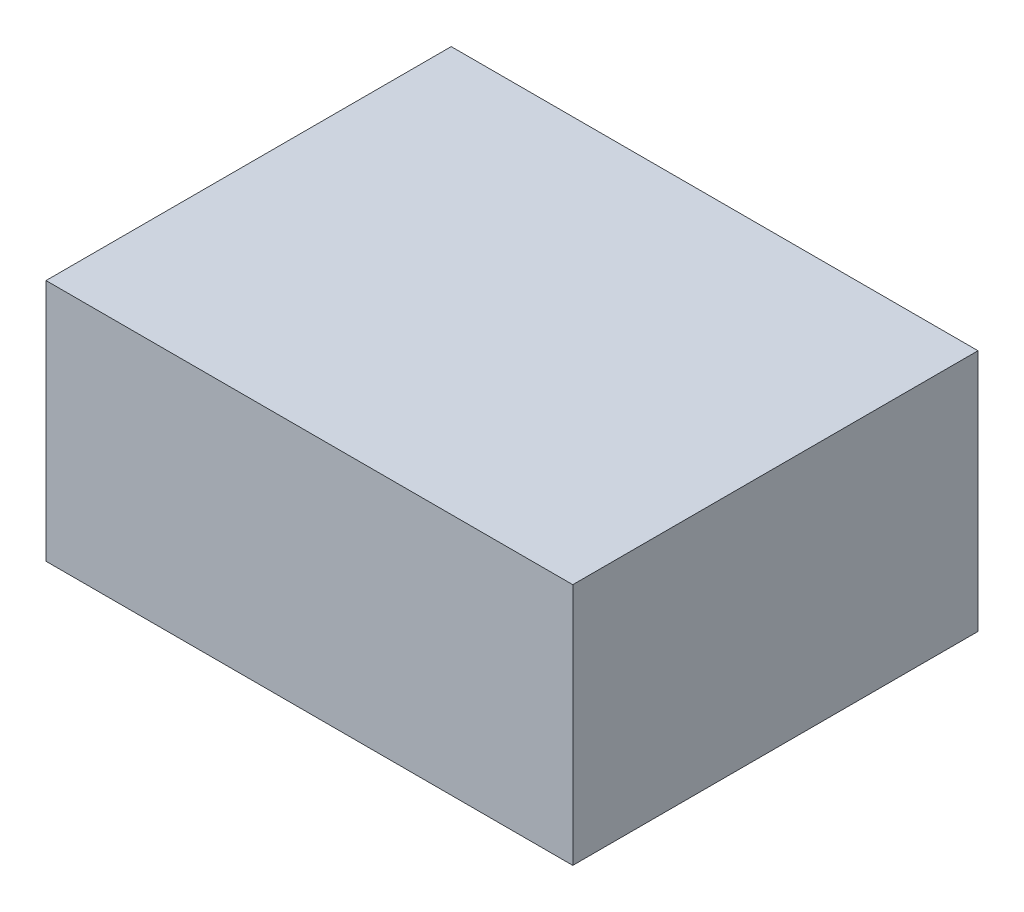
ISO-10303-21;
HEADER;
FILE_DESCRIPTION(('STEP AP214'),'2;1');
FILE_NAME('part.step','',(''),(''),'','','');
FILE_SCHEMA(('AUTOMOTIVE_DESIGN { 1 0 10303 214 1 1 1 1 }'));
ENDSEC;
DATA;
#1=APPLICATION_CONTEXT('core data for automotive mechanical design processes');
#2=APPLICATION_PROTOCOL_DEFINITION('international standard','automotive_design',2000,#1);
#3=PRODUCT_CONTEXT('',#1,'mechanical');
#4=PRODUCT('Part','Part','',(#3));
#5=PRODUCT_RELATED_PRODUCT_CATEGORY('part','',(#4));
#6=PRODUCT_DEFINITION_FORMATION('','',#4);
#7=PRODUCT_DEFINITION_CONTEXT('part definition',#1,'design');
#8=PRODUCT_DEFINITION('design','',#6,#7);
#9=PRODUCT_DEFINITION_SHAPE('','',#8);
#10=(LENGTH_UNIT() NAMED_UNIT(*) SI_UNIT(.MILLI.,.METRE.));
#11=(NAMED_UNIT(*) PLANE_ANGLE_UNIT() SI_UNIT($,.RADIAN.));
#12=(NAMED_UNIT(*) SI_UNIT($,.STERADIAN.) SOLID_ANGLE_UNIT());
#13=UNCERTAINTY_MEASURE_WITH_UNIT(LENGTH_MEASURE(1.E-05),#10,'distance_accuracy_value','');
#14=(GEOMETRIC_REPRESENTATION_CONTEXT(3) GLOBAL_UNCERTAINTY_ASSIGNED_CONTEXT((#13)) GLOBAL_UNIT_ASSIGNED_CONTEXT((#10,
#11,#12)) REPRESENTATION_CONTEXT('',''));
#15=CARTESIAN_POINT('',(0.,0.,0.));
#16=DIRECTION('',(0.,0.,1.));
#17=DIRECTION('',(1.,0.,0.));
#18=AXIS2_PLACEMENT_3D('',#15,#16,#17);
#19=CARTESIAN_POINT('',(1.3,1.2,-1.));
#20=DIRECTION('',(-1.,0.,0.));
#21=DIRECTION('',(0.,0.,1.));
#22=AXIS2_PLACEMENT_3D('',#19,#20,#21);
#23=PLANE('',#22);
#24=DIRECTION('',(0.,0.,-1.));
#25=VECTOR('',#24,1.);
#26=CARTESIAN_POINT('',(1.3,0.,-1.));
#27=LINE('',#26,#25);
#28=CARTESIAN_POINT('',(1.3,0.,1.));
#29=VERTEX_POINT('',#28);
#30=CARTESIAN_POINT('',(1.3,0.,-1.));
#31=VERTEX_POINT('',#30);
#32=EDGE_CURVE('E11',#29,#31,#27,.T.);
#33=ORIENTED_EDGE('',*,*,#32,.T.);
#34=DIRECTION('',(0.,-1.,0.));
#35=VECTOR('',#34,1.);
#36=CARTESIAN_POINT('',(1.3,1.2,-1.));
#37=LINE('',#36,#35);
#38=CARTESIAN_POINT('',(1.3,1.2,-1.));
#39=VERTEX_POINT('',#38);
#40=EDGE_CURVE('E24',#39,#31,#37,.T.);
#41=ORIENTED_EDGE('',*,*,#40,.F.);
#42=DIRECTION('',(0.,0.,-1.));
#43=VECTOR('',#42,1.);
#44=CARTESIAN_POINT('',(1.3,1.2,-1.));
#45=LINE('',#44,#43);
#46=CARTESIAN_POINT('',(1.3,1.2,1.));
#47=VERTEX_POINT('',#46);
#48=EDGE_CURVE('E88',#47,#39,#45,.T.);
#49=ORIENTED_EDGE('',*,*,#48,.F.);
#50=DIRECTION('',(0.,-1.,0.));
#51=VECTOR('',#50,1.);
#52=CARTESIAN_POINT('',(1.3,1.2,1.));
#53=LINE('',#52,#51);
#54=EDGE_CURVE('E77',#47,#29,#53,.T.);
#55=ORIENTED_EDGE('',*,*,#54,.T.);
#56=EDGE_LOOP('',(#33,#41,#49,#55));
#57=FACE_BOUND('',#56,.T.);
#58=ADVANCED_FACE('F17',(#57),#23,.F.);
#59=CARTESIAN_POINT('',(-1.3,1.2,-1.));
#60=DIRECTION('',(0.,0.,1.));
#61=DIRECTION('',(1.,0.,0.));
#62=AXIS2_PLACEMENT_3D('',#59,#60,#61);
#63=PLANE('',#62);
#64=DIRECTION('',(-1.,0.,0.));
#65=VECTOR('',#64,1.);
#66=CARTESIAN_POINT('',(-1.3,0.,-1.));
#67=LINE('',#66,#65);
#68=CARTESIAN_POINT('',(-1.3,0.,-1.));
#69=VERTEX_POINT('',#68);
#70=EDGE_CURVE('E85',#31,#69,#67,.T.);
#71=ORIENTED_EDGE('',*,*,#70,.T.);
#72=DIRECTION('',(0.,-1.,0.));
#73=VECTOR('',#72,1.);
#74=CARTESIAN_POINT('',(-1.3,1.2,-1.));
#75=LINE('',#74,#73);
#76=CARTESIAN_POINT('',(-1.3,1.2,-1.));
#77=VERTEX_POINT('',#76);
#78=EDGE_CURVE('E83',#77,#69,#75,.T.);
#79=ORIENTED_EDGE('',*,*,#78,.F.);
#80=DIRECTION('',(-1.,0.,0.));
#81=VECTOR('',#80,1.);
#82=CARTESIAN_POINT('',(-1.3,1.2,-1.));
#83=LINE('',#82,#81);
#84=EDGE_CURVE('E72',#39,#77,#83,.T.);
#85=ORIENTED_EDGE('',*,*,#84,.F.);
#86=ORIENTED_EDGE('',*,*,#40,.T.);
#87=EDGE_LOOP('',(#71,#79,#85,#86));
#88=FACE_BOUND('',#87,.T.);
#89=ADVANCED_FACE('F90',(#88),#63,.F.);
#90=CARTESIAN_POINT('',(-1.3,1.2,-1.));
#91=DIRECTION('',(1.,0.,0.));
#92=DIRECTION('',(0.,0.,-1.));
#93=AXIS2_PLACEMENT_3D('',#90,#91,#92);
#94=PLANE('',#93);
#95=DIRECTION('',(0.,0.,1.));
#96=VECTOR('',#95,1.);
#97=CARTESIAN_POINT('',(-1.3,0.,-1.));
#98=LINE('',#97,#96);
#99=CARTESIAN_POINT('',(-1.3,0.,1.));
#100=VERTEX_POINT('',#99);
#101=EDGE_CURVE('E60',#69,#100,#98,.T.);
#102=ORIENTED_EDGE('',*,*,#101,.T.);
#103=DIRECTION('',(0.,-1.,0.));
#104=VECTOR('',#103,1.);
#105=CARTESIAN_POINT('',(-1.3,1.2,1.));
#106=LINE('',#105,#104);
#107=CARTESIAN_POINT('',(-1.3,1.2,1.));
#108=VERTEX_POINT('',#107);
#109=EDGE_CURVE('E54',#108,#100,#106,.T.);
#110=ORIENTED_EDGE('',*,*,#109,.F.);
#111=DIRECTION('',(0.,0.,1.));
#112=VECTOR('',#111,1.);
#113=CARTESIAN_POINT('',(-1.3,1.2,-1.));
#114=LINE('',#113,#112);
#115=EDGE_CURVE('E58',#77,#108,#114,.T.);
#116=ORIENTED_EDGE('',*,*,#115,.F.);
#117=ORIENTED_EDGE('',*,*,#78,.T.);
#118=EDGE_LOOP('',(#102,#110,#116,#117));
#119=FACE_BOUND('',#118,.T.);
#120=ADVANCED_FACE('F56',(#119),#94,.F.);
#121=CARTESIAN_POINT('',(-1.3,1.2,1.));
#122=DIRECTION('',(0.,0.,-1.));
#123=DIRECTION('',(-1.,0.,0.));
#124=AXIS2_PLACEMENT_3D('',#121,#122,#123);
#125=PLANE('',#124);
#126=DIRECTION('',(1.,0.,0.));
#127=VECTOR('',#126,1.);
#128=CARTESIAN_POINT('',(-1.3,0.,1.));
#129=LINE('',#128,#127);
#130=EDGE_CURVE('E73',#100,#29,#129,.T.);
#131=ORIENTED_EDGE('',*,*,#130,.T.);
#132=ORIENTED_EDGE('',*,*,#54,.F.);
#133=DIRECTION('',(1.,0.,0.));
#134=VECTOR('',#133,1.);
#135=CARTESIAN_POINT('',(-1.3,1.2,1.));
#136=LINE('',#135,#134);
#137=EDGE_CURVE('E70',#108,#47,#136,.T.);
#138=ORIENTED_EDGE('',*,*,#137,.F.);
#139=ORIENTED_EDGE('',*,*,#109,.T.);
#140=EDGE_LOOP('',(#131,#132,#138,#139));
#141=FACE_BOUND('',#140,.T.);
#142=ADVANCED_FACE('F76',(#141),#125,.F.);
#143=CARTESIAN_POINT('',(0.,1.2,0.));
#144=DIRECTION('',(0.,1.,0.));
#145=DIRECTION('',(0.,0.,1.));
#146=AXIS2_PLACEMENT_3D('',#143,#144,#145);
#147=PLANE('',#146);
#148=ORIENTED_EDGE('',*,*,#48,.T.);
#149=ORIENTED_EDGE('',*,*,#84,.T.);
#150=ORIENTED_EDGE('',*,*,#115,.T.);
#151=ORIENTED_EDGE('',*,*,#137,.T.);
#152=EDGE_LOOP('',(#148,#149,#150,#151));
#153=FACE_BOUND('',#152,.T.);
#154=ADVANCED_FACE('F69',(#153),#147,.T.);
#155=CARTESIAN_POINT('',(0.,0.,0.));
#156=DIRECTION('',(0.,1.,0.));
#157=DIRECTION('',(0.,0.,1.));
#158=AXIS2_PLACEMENT_3D('',#155,#156,#157);
#159=PLANE('',#158);
#160=ORIENTED_EDGE('',*,*,#32,.F.);
#161=ORIENTED_EDGE('',*,*,#130,.F.);
#162=ORIENTED_EDGE('',*,*,#101,.F.);
#163=ORIENTED_EDGE('',*,*,#70,.F.);
#164=EDGE_LOOP('',(#160,#161,#162,#163));
#165=FACE_BOUND('',#164,.T.);
#166=ADVANCED_FACE('F91',(#165),#159,.F.);
#167=CLOSED_SHELL('',(#58,#89,#120,#142,#154,#166));
#168=MANIFOLD_SOLID_BREP('B1',#167);
#169=ADVANCED_BREP_SHAPE_REPRESENTATION('',(#18,#168),#14);
#170=SHAPE_DEFINITION_REPRESENTATION(#9,#169);
ENDSEC;
END-ISO-10303-21;
